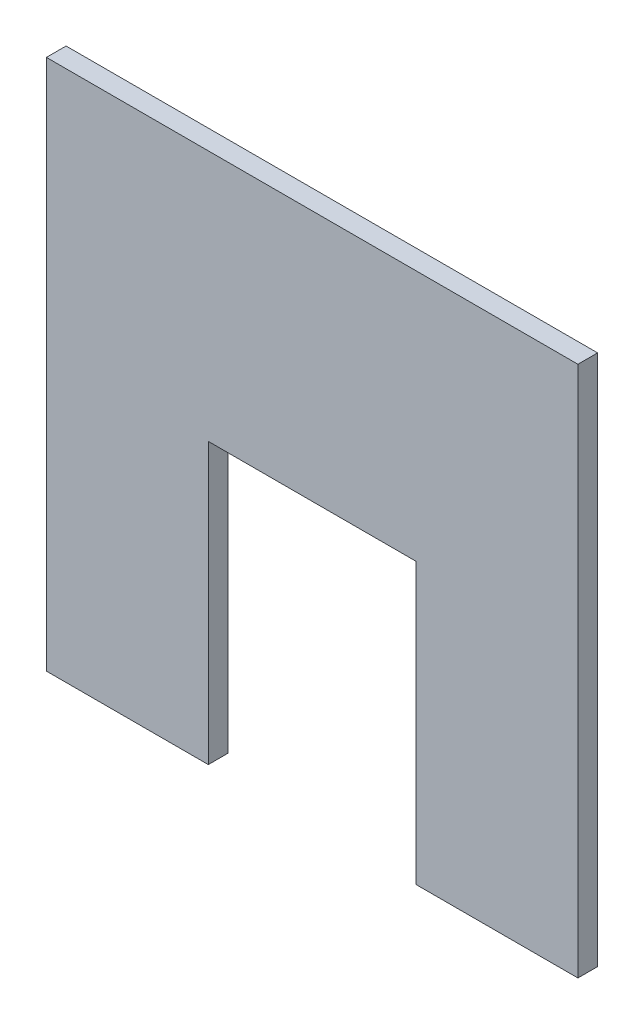
ISO-10303-21;
HEADER;
FILE_DESCRIPTION(('STEP AP214'),'2;1');
FILE_NAME('part.step','',(''),(''),'','','');
FILE_SCHEMA(('AUTOMOTIVE_DESIGN { 1 0 10303 214 1 1 1 1 }'));
ENDSEC;
DATA;
#1=APPLICATION_CONTEXT('core data for automotive mechanical design processes');
#2=APPLICATION_PROTOCOL_DEFINITION('international standard','automotive_design',2000,#1);
#3=PRODUCT_CONTEXT('',#1,'mechanical');
#4=PRODUCT('Part','Part','',(#3));
#5=PRODUCT_RELATED_PRODUCT_CATEGORY('part','',(#4));
#6=PRODUCT_DEFINITION_FORMATION('','',#4);
#7=PRODUCT_DEFINITION_CONTEXT('part definition',#1,'design');
#8=PRODUCT_DEFINITION('design','',#6,#7);
#9=PRODUCT_DEFINITION_SHAPE('','',#8);
#10=(LENGTH_UNIT() NAMED_UNIT(*) SI_UNIT(.MILLI.,.METRE.));
#11=(NAMED_UNIT(*) PLANE_ANGLE_UNIT() SI_UNIT($,.RADIAN.));
#12=(NAMED_UNIT(*) SI_UNIT($,.STERADIAN.) SOLID_ANGLE_UNIT());
#13=UNCERTAINTY_MEASURE_WITH_UNIT(LENGTH_MEASURE(1.E-05),#10,'distance_accuracy_value','');
#14=(GEOMETRIC_REPRESENTATION_CONTEXT(3) GLOBAL_UNCERTAINTY_ASSIGNED_CONTEXT((#13)) GLOBAL_UNIT_ASSIGNED_CONTEXT((#10,
#11,#12)) REPRESENTATION_CONTEXT('',''));
#15=CARTESIAN_POINT('',(0.,0.,0.));
#16=DIRECTION('',(0.,0.,1.));
#17=DIRECTION('',(1.,0.,0.));
#18=AXIS2_PLACEMENT_3D('',#15,#16,#17);
#19=CARTESIAN_POINT('',(-44.237704694695,-48.4732296122721,2.54));
#20=DIRECTION('',(0.,1.,0.));
#21=DIRECTION('',(0.,0.,1.));
#22=AXIS2_PLACEMENT_3D('',#19,#20,#21);
#23=PLANE('',#22);
#24=DIRECTION('',(1.,0.,0.));
#25=VECTOR('',#24,1.);
#26=CARTESIAN_POINT('',(-44.237704694695,-48.4732296122721,2.54));
#27=LINE('',#26,#25);
#28=CARTESIAN_POINT('',(3.45094929293482,-48.4732296122721,2.54));
#29=VERTEX_POINT('',#28);
#30=CARTESIAN_POINT('',(24.3422953053051,-48.4732296122721,2.54));
#31=VERTEX_POINT('',#30);
#32=EDGE_CURVE('E136',#29,#31,#27,.T.);
#33=ORIENTED_EDGE('',*,*,#32,.F.);
#34=DIRECTION('',(0.,0.,-1.));
#35=VECTOR('',#34,1.);
#36=CARTESIAN_POINT('',(3.45094929293482,-48.4732296122721,2.54));
#37=LINE('',#36,#35);
#38=CARTESIAN_POINT('',(3.45094929293482,-48.4732296122721,0.));
#39=VERTEX_POINT('',#38);
#40=EDGE_CURVE('E114',#29,#39,#37,.T.);
#41=ORIENTED_EDGE('',*,*,#40,.T.);
#42=DIRECTION('',(1.,0.,0.));
#43=VECTOR('',#42,1.);
#44=CARTESIAN_POINT('',(-44.237704694695,-48.4732296122721,0.));
#45=LINE('',#44,#43);
#46=CARTESIAN_POINT('',(24.3422953053051,-48.4732296122721,0.));
#47=VERTEX_POINT('',#46);
#48=EDGE_CURVE('E144',#39,#47,#45,.T.);
#49=ORIENTED_EDGE('',*,*,#48,.T.);
#50=DIRECTION('',(0.,0.,-1.));
#51=VECTOR('',#50,1.);
#52=CARTESIAN_POINT('',(24.3422953053051,-48.4732296122721,2.54));
#53=LINE('',#52,#51);
#54=EDGE_CURVE('E154',#31,#47,#53,.T.);
#55=ORIENTED_EDGE('',*,*,#54,.F.);
#56=EDGE_LOOP('',(#33,#41,#49,#55));
#57=FACE_BOUND('',#56,.T.);
#58=ADVANCED_FACE('F33',(#57),#23,.F.);
#59=CARTESIAN_POINT('',(-44.237704694695,20.1067703877279,2.54));
#60=DIRECTION('',(1.,0.,0.));
#61=DIRECTION('',(0.,1.,0.));
#62=AXIS2_PLACEMENT_3D('',#59,#60,#61);
#63=PLANE('',#62);
#64=DIRECTION('',(0.,-1.,0.));
#65=VECTOR('',#64,1.);
#66=CARTESIAN_POINT('',(-44.237704694695,20.1067703877279,0.));
#67=LINE('',#66,#65);
#68=CARTESIAN_POINT('',(-44.237704694695,20.1067703877279,0.));
#69=VERTEX_POINT('',#68);
#70=CARTESIAN_POINT('',(-44.237704694695,-48.4732296122721,0.));
#71=VERTEX_POINT('',#70);
#72=EDGE_CURVE('E133',#69,#71,#67,.T.);
#73=ORIENTED_EDGE('',*,*,#72,.T.);
#74=DIRECTION('',(0.,0.,-1.));
#75=VECTOR('',#74,1.);
#76=CARTESIAN_POINT('',(-44.237704694695,-48.4732296122721,2.54));
#77=LINE('',#76,#75);
#78=CARTESIAN_POINT('',(-44.237704694695,-48.4732296122721,2.54));
#79=VERTEX_POINT('',#78);
#80=EDGE_CURVE('E157',#79,#71,#77,.T.);
#81=ORIENTED_EDGE('',*,*,#80,.F.);
#82=DIRECTION('',(0.,-1.,0.));
#83=VECTOR('',#82,1.);
#84=CARTESIAN_POINT('',(-44.237704694695,20.1067703877279,2.54));
#85=LINE('',#84,#83);
#86=CARTESIAN_POINT('',(-44.237704694695,20.1067703877279,2.54));
#87=VERTEX_POINT('',#86);
#88=EDGE_CURVE('E134',#87,#79,#85,.T.);
#89=ORIENTED_EDGE('',*,*,#88,.F.);
#90=DIRECTION('',(0.,0.,-1.));
#91=VECTOR('',#90,1.);
#92=CARTESIAN_POINT('',(-44.237704694695,20.1067703877279,2.54));
#93=LINE('',#92,#91);
#94=EDGE_CURVE('E141',#87,#69,#93,.T.);
#95=ORIENTED_EDGE('',*,*,#94,.T.);
#96=EDGE_LOOP('',(#73,#81,#89,#95));
#97=FACE_BOUND('',#96,.T.);
#98=ADVANCED_FACE('F35',(#97),#63,.F.);
#99=CARTESIAN_POINT('',(-23.3463586823247,-48.4732296122721,0.));
#100=VERTEX_POINT('',#99);
#101=EDGE_CURVE('E145',#71,#100,#45,.T.);
#102=ORIENTED_EDGE('',*,*,#101,.T.);
#103=DIRECTION('',(0.,0.,1.));
#104=VECTOR('',#103,1.);
#105=CARTESIAN_POINT('',(-23.3463586823247,-48.4732296122721,2.54));
#106=LINE('',#105,#104);
#107=CARTESIAN_POINT('',(-23.3463586823247,-48.4732296122721,2.54));
#108=VERTEX_POINT('',#107);
#109=EDGE_CURVE('E129',#100,#108,#106,.T.);
#110=ORIENTED_EDGE('',*,*,#109,.T.);
#111=EDGE_CURVE('E86',#79,#108,#27,.T.);
#112=ORIENTED_EDGE('',*,*,#111,.F.);
#113=ORIENTED_EDGE('',*,*,#80,.T.);
#114=EDGE_LOOP('',(#102,#110,#112,#113));
#115=FACE_BOUND('',#114,.T.);
#116=ADVANCED_FACE('F165',(#115),#23,.F.);
#117=CARTESIAN_POINT('',(24.342295305305,20.1067703877279,2.54));
#118=DIRECTION('',(-1.,0.,0.));
#119=DIRECTION('',(0.,-1.,0.));
#120=AXIS2_PLACEMENT_3D('',#117,#118,#119);
#121=PLANE('',#120);
#122=DIRECTION('',(0.,1.,0.));
#123=VECTOR('',#122,1.);
#124=CARTESIAN_POINT('',(24.342295305305,20.1067703877279,0.));
#125=LINE('',#124,#123);
#126=CARTESIAN_POINT('',(24.342295305305,20.1067703877279,0.));
#127=VERTEX_POINT('',#126);
#128=EDGE_CURVE('E148',#47,#127,#125,.T.);
#129=ORIENTED_EDGE('',*,*,#128,.T.);
#130=DIRECTION('',(0.,0.,-1.));
#131=VECTOR('',#130,1.);
#132=CARTESIAN_POINT('',(24.342295305305,20.1067703877279,2.54));
#133=LINE('',#132,#131);
#134=CARTESIAN_POINT('',(24.342295305305,20.1067703877279,2.54));
#135=VERTEX_POINT('',#134);
#136=EDGE_CURVE('E152',#135,#127,#133,.T.);
#137=ORIENTED_EDGE('',*,*,#136,.F.);
#138=DIRECTION('',(0.,1.,0.));
#139=VECTOR('',#138,1.);
#140=CARTESIAN_POINT('',(24.342295305305,20.1067703877279,2.54));
#141=LINE('',#140,#139);
#142=EDGE_CURVE('E138',#31,#135,#141,.T.);
#143=ORIENTED_EDGE('',*,*,#142,.F.);
#144=ORIENTED_EDGE('',*,*,#54,.T.);
#145=EDGE_LOOP('',(#129,#137,#143,#144));
#146=FACE_BOUND('',#145,.T.);
#147=ADVANCED_FACE('F172',(#146),#121,.F.);
#148=CARTESIAN_POINT('',(-44.237704694695,20.1067703877279,2.54));
#149=DIRECTION('',(0.,-1.,0.));
#150=DIRECTION('',(0.,0.,-1.));
#151=AXIS2_PLACEMENT_3D('',#148,#149,#150);
#152=PLANE('',#151);
#153=DIRECTION('',(-1.,0.,0.));
#154=VECTOR('',#153,1.);
#155=CARTESIAN_POINT('',(-44.237704694695,20.1067703877279,0.));
#156=LINE('',#155,#154);
#157=EDGE_CURVE('E78',#127,#69,#156,.T.);
#158=ORIENTED_EDGE('',*,*,#157,.T.);
#159=ORIENTED_EDGE('',*,*,#94,.F.);
#160=DIRECTION('',(-1.,0.,0.));
#161=VECTOR('',#160,1.);
#162=CARTESIAN_POINT('',(-44.237704694695,20.1067703877279,2.54));
#163=LINE('',#162,#161);
#164=EDGE_CURVE('E57',#135,#87,#163,.T.);
#165=ORIENTED_EDGE('',*,*,#164,.F.);
#166=ORIENTED_EDGE('',*,*,#136,.T.);
#167=EDGE_LOOP('',(#158,#159,#165,#166));
#168=FACE_BOUND('',#167,.T.);
#169=ADVANCED_FACE('F175',(#168),#152,.F.);
#170=CARTESIAN_POINT('',(0.,0.,2.54));
#171=DIRECTION('',(0.,0.,1.));
#172=DIRECTION('',(1.,0.,0.));
#173=AXIS2_PLACEMENT_3D('',#170,#171,#172);
#174=PLANE('',#173);
#175=DIRECTION('',(0.,1.,0.));
#176=VECTOR('',#175,1.);
#177=CARTESIAN_POINT('',(3.45094929293482,-84.5903187924035,2.54));
#178=LINE('',#177,#176);
#179=CARTESIAN_POINT('',(3.45094929293482,-12.3561404321408,2.54));
#180=VERTEX_POINT('',#179);
#181=EDGE_CURVE('E109',#29,#180,#178,.T.);
#182=ORIENTED_EDGE('',*,*,#181,.F.);
#183=ORIENTED_EDGE('',*,*,#32,.T.);
#184=ORIENTED_EDGE('',*,*,#142,.T.);
#185=ORIENTED_EDGE('',*,*,#164,.T.);
#186=ORIENTED_EDGE('',*,*,#88,.T.);
#187=ORIENTED_EDGE('',*,*,#111,.T.);
#188=DIRECTION('',(0.,-1.,0.));
#189=VECTOR('',#188,1.);
#190=CARTESIAN_POINT('',(-23.3463586823247,-84.5903187924035,2.54));
#191=LINE('',#190,#189);
#192=CARTESIAN_POINT('',(-23.3463586823247,-12.3561404321408,2.54));
#193=VERTEX_POINT('',#192);
#194=EDGE_CURVE('E123',#193,#108,#191,.T.);
#195=ORIENTED_EDGE('',*,*,#194,.F.);
#196=DIRECTION('',(-1.,0.,0.));
#197=VECTOR('',#196,1.);
#198=CARTESIAN_POINT('',(-23.3463586823247,-12.3561404321408,2.54));
#199=LINE('',#198,#197);
#200=EDGE_CURVE('E117',#180,#193,#199,.T.);
#201=ORIENTED_EDGE('',*,*,#200,.F.);
#202=EDGE_LOOP('',(#182,#183,#184,#185,#186,#187,#195,#201));
#203=FACE_BOUND('',#202,.T.);
#204=ADVANCED_FACE('F125',(#203),#174,.T.);
#205=CARTESIAN_POINT('',(0.,0.,0.));
#206=DIRECTION('',(0.,0.,1.));
#207=DIRECTION('',(1.,0.,0.));
#208=AXIS2_PLACEMENT_3D('',#205,#206,#207);
#209=PLANE('',#208);
#210=ORIENTED_EDGE('',*,*,#48,.F.);
#211=DIRECTION('',(0.,1.,0.));
#212=VECTOR('',#211,1.);
#213=CARTESIAN_POINT('',(3.45094929293482,0.,0.));
#214=LINE('',#213,#212);
#215=CARTESIAN_POINT('',(3.45094929293482,-12.3561404321408,0.));
#216=VERTEX_POINT('',#215);
#217=EDGE_CURVE('E11',#39,#216,#214,.T.);
#218=ORIENTED_EDGE('',*,*,#217,.T.);
#219=DIRECTION('',(-1.,0.,0.));
#220=VECTOR('',#219,1.);
#221=CARTESIAN_POINT('',(0.,-12.3561404321408,0.));
#222=LINE('',#221,#220);
#223=CARTESIAN_POINT('',(-23.3463586823247,-12.3561404321408,0.));
#224=VERTEX_POINT('',#223);
#225=EDGE_CURVE('E122',#216,#224,#222,.T.);
#226=ORIENTED_EDGE('',*,*,#225,.T.);
#227=DIRECTION('',(0.,-1.,0.));
#228=VECTOR('',#227,1.);
#229=CARTESIAN_POINT('',(-23.3463586823247,0.,0.));
#230=LINE('',#229,#228);
#231=EDGE_CURVE('E41',#224,#100,#230,.T.);
#232=ORIENTED_EDGE('',*,*,#231,.T.);
#233=ORIENTED_EDGE('',*,*,#101,.F.);
#234=ORIENTED_EDGE('',*,*,#72,.F.);
#235=ORIENTED_EDGE('',*,*,#157,.F.);
#236=ORIENTED_EDGE('',*,*,#128,.F.);
#237=EDGE_LOOP('',(#210,#218,#226,#232,#233,#234,#235,#236));
#238=FACE_BOUND('',#237,.T.);
#239=ADVANCED_FACE('F162',(#238),#209,.F.);
#240=CARTESIAN_POINT('',(3.45094929293482,-84.5903187924035,-34.036));
#241=DIRECTION('',(1.,0.,0.));
#242=DIRECTION('',(0.,0.,-1.));
#243=AXIS2_PLACEMENT_3D('',#240,#241,#242);
#244=PLANE('',#243);
#245=ORIENTED_EDGE('',*,*,#181,.T.);
#246=DIRECTION('',(0.,0.,1.));
#247=VECTOR('',#246,1.);
#248=CARTESIAN_POINT('',(3.45094929293482,-12.3561404321408,-34.036));
#249=LINE('',#248,#247);
#250=EDGE_CURVE('E112',#216,#180,#249,.T.);
#251=ORIENTED_EDGE('',*,*,#250,.F.);
#252=ORIENTED_EDGE('',*,*,#217,.F.);
#253=ORIENTED_EDGE('',*,*,#40,.F.);
#254=EDGE_LOOP('',(#245,#251,#252,#253));
#255=FACE_BOUND('',#254,.T.);
#256=ADVANCED_FACE('F111',(#255),#244,.F.);
#257=CARTESIAN_POINT('',(-23.3463586823247,-84.5903187924035,-34.036));
#258=DIRECTION('',(-1.,0.,0.));
#259=DIRECTION('',(0.,0.,1.));
#260=AXIS2_PLACEMENT_3D('',#257,#258,#259);
#261=PLANE('',#260);
#262=ORIENTED_EDGE('',*,*,#231,.F.);
#263=DIRECTION('',(0.,0.,1.));
#264=VECTOR('',#263,1.);
#265=CARTESIAN_POINT('',(-23.3463586823247,-12.3561404321408,-34.036));
#266=LINE('',#265,#264);
#267=EDGE_CURVE('E48',#224,#193,#266,.T.);
#268=ORIENTED_EDGE('',*,*,#267,.T.);
#269=ORIENTED_EDGE('',*,*,#194,.T.);
#270=ORIENTED_EDGE('',*,*,#109,.F.);
#271=EDGE_LOOP('',(#262,#268,#269,#270));
#272=FACE_BOUND('',#271,.T.);
#273=ADVANCED_FACE('F225',(#272),#261,.F.);
#274=CARTESIAN_POINT('',(-23.3463586823247,-12.3561404321408,-34.036));
#275=DIRECTION('',(0.,1.,0.));
#276=DIRECTION('',(0.,0.,1.));
#277=AXIS2_PLACEMENT_3D('',#274,#275,#276);
#278=PLANE('',#277);
#279=ORIENTED_EDGE('',*,*,#250,.T.);
#280=ORIENTED_EDGE('',*,*,#200,.T.);
#281=ORIENTED_EDGE('',*,*,#267,.F.);
#282=ORIENTED_EDGE('',*,*,#225,.F.);
#283=EDGE_LOOP('',(#279,#280,#281,#282));
#284=FACE_BOUND('',#283,.T.);
#285=ADVANCED_FACE('F119',(#284),#278,.F.);
#286=CLOSED_SHELL('',(#58,#98,#116,#147,#169,#204,#239,#256,#273,#285));
#287=MANIFOLD_SOLID_BREP('B2',#286);
#288=ADVANCED_BREP_SHAPE_REPRESENTATION('',(#18,#287),#14);
#289=SHAPE_DEFINITION_REPRESENTATION(#9,#288);
ENDSEC;
END-ISO-10303-21;
